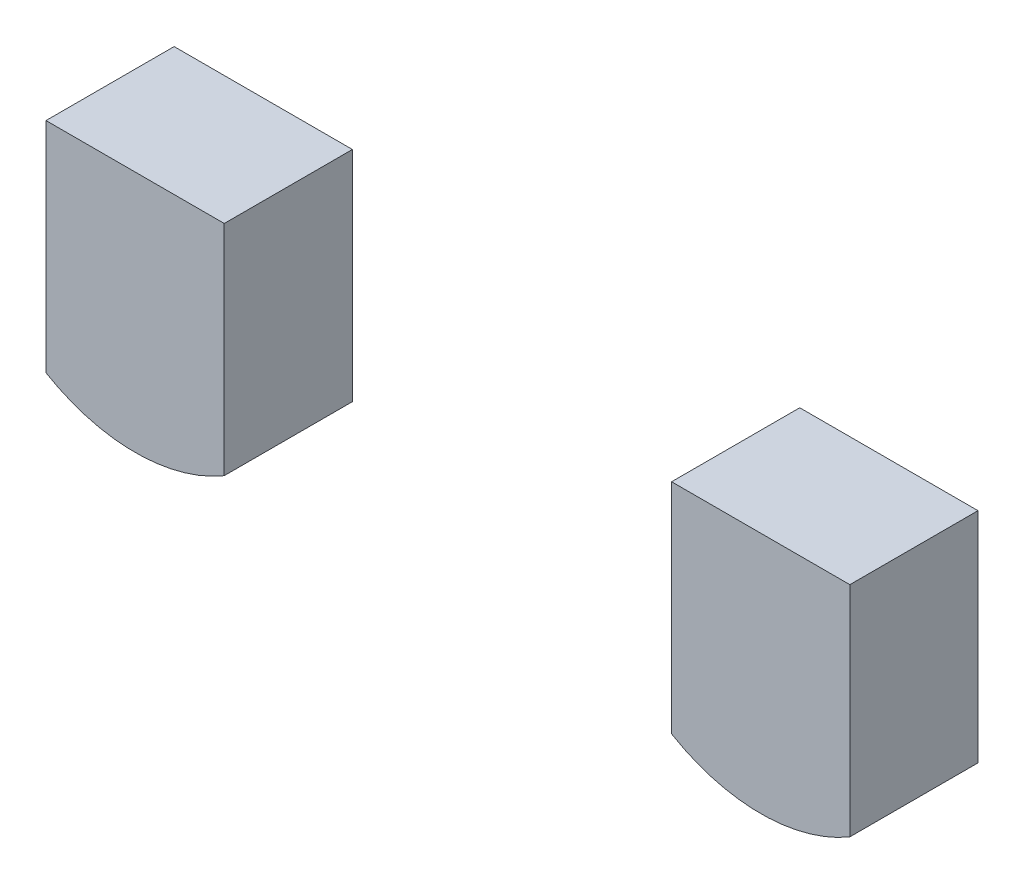
ISO-10303-21;
HEADER;
FILE_DESCRIPTION(('STEP AP214'),'2;1');
FILE_NAME('part.step','',(''),(''),'','','');
FILE_SCHEMA(('AUTOMOTIVE_DESIGN { 1 0 10303 214 1 1 1 1 }'));
ENDSEC;
DATA;
#1=APPLICATION_CONTEXT('core data for automotive mechanical design processes');
#2=APPLICATION_PROTOCOL_DEFINITION('international standard','automotive_design',2000,#1);
#3=PRODUCT_CONTEXT('',#1,'mechanical');
#4=PRODUCT('Part','Part','',(#3));
#5=PRODUCT_RELATED_PRODUCT_CATEGORY('part','',(#4));
#6=PRODUCT_DEFINITION_FORMATION('','',#4);
#7=PRODUCT_DEFINITION_CONTEXT('part definition',#1,'design');
#8=PRODUCT_DEFINITION('design','',#6,#7);
#9=PRODUCT_DEFINITION_SHAPE('','',#8);
#10=(LENGTH_UNIT() NAMED_UNIT(*) SI_UNIT(.MILLI.,.METRE.));
#11=(NAMED_UNIT(*) PLANE_ANGLE_UNIT() SI_UNIT($,.RADIAN.));
#12=(NAMED_UNIT(*) SI_UNIT($,.STERADIAN.) SOLID_ANGLE_UNIT());
#13=UNCERTAINTY_MEASURE_WITH_UNIT(LENGTH_MEASURE(1.E-05),#10,'distance_accuracy_value','');
#14=(GEOMETRIC_REPRESENTATION_CONTEXT(3) GLOBAL_UNCERTAINTY_ASSIGNED_CONTEXT((#13)) GLOBAL_UNIT_ASSIGNED_CONTEXT((#10,
#11,#12)) REPRESENTATION_CONTEXT('',''));
#15=CARTESIAN_POINT('',(0.,0.,0.));
#16=DIRECTION('',(0.,0.,1.));
#17=DIRECTION('',(1.,0.,0.));
#18=AXIS2_PLACEMENT_3D('',#15,#16,#17);
#19=CARTESIAN_POINT('',(3.83000000000006,-10.9171416205416,3.30000000000001));
#20=DIRECTION('',(0.,0.,1.));
#21=DIRECTION('',(1.,0.,0.));
#22=AXIS2_PLACEMENT_3D('',#19,#20,#21);
#23=PLANE('',#22);
#24=DIRECTION('',(0.,-1.,0.));
#25=VECTOR('',#24,1.);
#26=CARTESIAN_POINT('',(6.90000000000007,-8.12500000000001,3.30000000000001));
#27=LINE('',#26,#25);
#28=CARTESIAN_POINT('',(6.90000000000007,-6.25000000000001,3.30000000000001));
#29=VERTEX_POINT('',#28);
#30=CARTESIAN_POINT('',(6.90000000000006,-10.,3.30000000000001));
#31=VERTEX_POINT('',#30);
#32=EDGE_CURVE('P0_E50',#29,#31,#27,.T.);
#33=ORIENTED_EDGE('',*,*,#32,.F.);
#34=DIRECTION('',(1.,0.,0.));
#35=VECTOR('',#34,1.);
#36=CARTESIAN_POINT('',(5.37000000000008,-6.25000000000001,3.30000000000002));
#37=LINE('',#36,#35);
#38=CARTESIAN_POINT('',(3.84000000000008,-6.25,3.30000000000001));
#39=VERTEX_POINT('',#38);
#40=EDGE_CURVE('P0_E58',#39,#29,#37,.T.);
#41=ORIENTED_EDGE('',*,*,#40,.F.);
#42=DIRECTION('',(0.,1.,0.));
#43=VECTOR('',#42,1.);
#44=CARTESIAN_POINT('',(3.84000000000007,-8.125,3.30000000000001));
#45=LINE('',#44,#43);
#46=CARTESIAN_POINT('',(3.84000000000006,-10.,3.30000000000001));
#47=VERTEX_POINT('',#46);
#48=EDGE_CURVE('P0_E69',#47,#39,#45,.T.);
#49=ORIENTED_EDGE('',*,*,#48,.F.);
#50=CARTESIAN_POINT('',(5.37000000000006,-7.41947679723659,3.30000000000001));
#51=DIRECTION('',(0.,0.,-1.));
#52=DIRECTION('',(-1.,0.,0.));
#53=AXIS2_PLACEMENT_3D('',#50,#51,#52);
#54=CIRCLE('',#53,3.00000000000006);
#55=EDGE_CURVE('P0_E21',#31,#47,#54,.T.);
#56=ORIENTED_EDGE('',*,*,#55,.F.);
#57=EDGE_LOOP('',(#33,#41,#49,#56));
#58=FACE_BOUND('',#57,.T.);
#59=ADVANCED_FACE('P0_F17',(#58),#23,.T.);
#60=CARTESIAN_POINT('',(3.84000000000008,-6.24,1.09));
#61=DIRECTION('',(-1.,0.,0.));
#62=DIRECTION('',(0.,-1.,0.));
#63=AXIS2_PLACEMENT_3D('',#60,#61,#62);
#64=PLANE('',#63);
#65=DIRECTION('',(0.,0.,1.));
#66=VECTOR('',#65,1.);
#67=CARTESIAN_POINT('',(3.84000000000008,-6.25,2.2));
#68=LINE('',#67,#66);
#69=CARTESIAN_POINT('',(3.84000000000008,-6.25,1.1));
#70=VERTEX_POINT('',#69);
#71=EDGE_CURVE('P0_E62',#70,#39,#68,.T.);
#72=ORIENTED_EDGE('',*,*,#71,.F.);
#73=DIRECTION('',(0.,1.,0.));
#74=VECTOR('',#73,1.);
#75=CARTESIAN_POINT('',(3.84000000000007,-8.5785708102708,1.1));
#76=LINE('',#75,#74);
#77=CARTESIAN_POINT('',(3.84000000000007,-10.,1.10000000000001));
#78=VERTEX_POINT('',#77);
#79=EDGE_CURVE('P0_E67',#78,#70,#76,.T.);
#80=ORIENTED_EDGE('',*,*,#79,.F.);
#81=DIRECTION('',(0.,0.,-1.));
#82=VECTOR('',#81,1.);
#83=CARTESIAN_POINT('',(3.84000000000006,-10.,2.20000000000001));
#84=LINE('',#83,#82);
#85=EDGE_CURVE('P0_E78',#47,#78,#84,.T.);
#86=ORIENTED_EDGE('',*,*,#85,.F.);
#87=ORIENTED_EDGE('',*,*,#48,.T.);
#88=EDGE_LOOP('',(#72,#80,#86,#87));
#89=FACE_BOUND('',#88,.T.);
#90=ADVANCED_FACE('P0_F64',(#89),#64,.T.);
#91=CARTESIAN_POINT('',(6.91000000000007,-6.25000000000001,1.09000000000001));
#92=DIRECTION('',(0.,1.,0.));
#93=DIRECTION('',(-1.,0.,0.));
#94=AXIS2_PLACEMENT_3D('',#91,#92,#93);
#95=PLANE('',#94);
#96=DIRECTION('',(0.,0.,1.));
#97=VECTOR('',#96,1.);
#98=CARTESIAN_POINT('',(6.90000000000007,-6.25000000000001,2.20000000000001));
#99=LINE('',#98,#97);
#100=CARTESIAN_POINT('',(6.90000000000007,-6.25000000000001,1.10000000000001));
#101=VERTEX_POINT('',#100);
#102=EDGE_CURVE('P0_E74',#101,#29,#99,.T.);
#103=ORIENTED_EDGE('',*,*,#102,.F.);
#104=DIRECTION('',(1.,0.,0.));
#105=VECTOR('',#104,1.);
#106=CARTESIAN_POINT('',(5.37000000000007,-6.25000000000001,1.1));
#107=LINE('',#106,#105);
#108=EDGE_CURVE('P0_E72',#70,#101,#107,.T.);
#109=ORIENTED_EDGE('',*,*,#108,.F.);
#110=ORIENTED_EDGE('',*,*,#71,.T.);
#111=ORIENTED_EDGE('',*,*,#40,.T.);
#112=EDGE_LOOP('',(#103,#109,#110,#111));
#113=FACE_BOUND('',#112,.T.);
#114=ADVANCED_FACE('P0_F73',(#113),#95,.T.);
#115=CARTESIAN_POINT('',(6.90000000000006,-10.01,1.09000000000001));
#116=DIRECTION('',(1.,0.,0.));
#117=DIRECTION('',(0.,1.,0.));
#118=AXIS2_PLACEMENT_3D('',#115,#116,#117);
#119=PLANE('',#118);
#120=DIRECTION('',(0.,0.,1.));
#121=VECTOR('',#120,1.);
#122=CARTESIAN_POINT('',(6.90000000000007,-10.,2.20000000000001));
#123=LINE('',#122,#121);
#124=CARTESIAN_POINT('',(6.90000000000007,-10.,1.10000000000001));
#125=VERTEX_POINT('',#124);
#126=EDGE_CURVE('P0_E35',#125,#31,#123,.T.);
#127=ORIENTED_EDGE('',*,*,#126,.F.);
#128=DIRECTION('',(0.,-1.,0.));
#129=VECTOR('',#128,1.);
#130=CARTESIAN_POINT('',(6.90000000000007,-8.5785708102708,1.10000000000001));
#131=LINE('',#130,#129);
#132=EDGE_CURVE('P0_E27',#101,#125,#131,.T.);
#133=ORIENTED_EDGE('',*,*,#132,.F.);
#134=ORIENTED_EDGE('',*,*,#102,.T.);
#135=ORIENTED_EDGE('',*,*,#32,.T.);
#136=EDGE_LOOP('',(#127,#133,#134,#135));
#137=FACE_BOUND('',#136,.T.);
#138=ADVANCED_FACE('P0_F103',(#137),#119,.T.);
#139=CARTESIAN_POINT('',(5.37000000000006,-7.41947679723659,3.30000000000001));
#140=DIRECTION('',(0.,0.,-1.));
#141=DIRECTION('',(-1.,0.,0.));
#142=AXIS2_PLACEMENT_3D('',#139,#140,#141);
#143=CYLINDRICAL_SURFACE('',#142,3.00000000000006);
#144=ORIENTED_EDGE('',*,*,#85,.T.);
#145=CARTESIAN_POINT('',(5.37000000000006,-7.41947679723659,1.10000000000001));
#146=DIRECTION('',(0.,0.,-1.));
#147=DIRECTION('',(-1.,0.,0.));
#148=AXIS2_PLACEMENT_3D('',#145,#146,#147);
#149=CIRCLE('',#148,3.00000000000006);
#150=EDGE_CURVE('P0_E11',#125,#78,#149,.T.);
#151=ORIENTED_EDGE('',*,*,#150,.F.);
#152=ORIENTED_EDGE('',*,*,#126,.T.);
#153=ORIENTED_EDGE('',*,*,#55,.T.);
#154=EDGE_LOOP('',(#144,#151,#152,#153));
#155=FACE_BOUND('',#154,.T.);
#156=ADVANCED_FACE('P0_F105',(#155),#143,.T.);
#157=CARTESIAN_POINT('',(6.91000000000006,-10.9171416205416,1.10000000000001));
#158=DIRECTION('',(0.,0.,-1.));
#159=DIRECTION('',(-1.,0.,0.));
#160=AXIS2_PLACEMENT_3D('',#157,#158,#159);
#161=PLANE('',#160);
#162=ORIENTED_EDGE('',*,*,#132,.T.);
#163=ORIENTED_EDGE('',*,*,#150,.T.);
#164=ORIENTED_EDGE('',*,*,#79,.T.);
#165=ORIENTED_EDGE('',*,*,#108,.T.);
#166=EDGE_LOOP('',(#162,#163,#164,#165));
#167=FACE_BOUND('',#166,.T.);
#168=ADVANCED_FACE('P0_F19',(#167),#161,.T.);
#169=CLOSED_SHELL('',(#59,#90,#114,#138,#156,#168));
#170=MANIFOLD_SOLID_BREP('P0_B1',#169);
#171=CARTESIAN_POINT('',(-6.90999999999993,-10.9171416205416,3.3));
#172=DIRECTION('',(0.,0.,1.));
#173=DIRECTION('',(1.,0.,0.));
#174=AXIS2_PLACEMENT_3D('',#171,#172,#173);
#175=PLANE('',#174);
#176=DIRECTION('',(0.,-1.,0.));
#177=VECTOR('',#176,1.);
#178=CARTESIAN_POINT('',(-3.83999999999992,-8.125,3.3));
#179=LINE('',#178,#177);
#180=CARTESIAN_POINT('',(-3.83999999999992,-6.25,3.3));
#181=VERTEX_POINT('',#180);
#182=CARTESIAN_POINT('',(-3.83999999999993,-10.,3.3));
#183=VERTEX_POINT('',#182);
#184=EDGE_CURVE('P1_E50',#181,#183,#179,.T.);
#185=ORIENTED_EDGE('',*,*,#184,.F.);
#186=DIRECTION('',(1.,0.,0.));
#187=VECTOR('',#186,1.);
#188=CARTESIAN_POINT('',(-5.36999999999992,-6.25,3.3));
#189=LINE('',#188,#187);
#190=CARTESIAN_POINT('',(-6.89999999999991,-6.24999999999999,3.3));
#191=VERTEX_POINT('',#190);
#192=EDGE_CURVE('P1_E58',#191,#181,#189,.T.);
#193=ORIENTED_EDGE('',*,*,#192,.F.);
#194=DIRECTION('',(0.,1.,0.));
#195=VECTOR('',#194,1.);
#196=CARTESIAN_POINT('',(-6.89999999999992,-8.12499999999999,3.3));
#197=LINE('',#196,#195);
#198=CARTESIAN_POINT('',(-6.89999999999993,-10.,3.3));
#199=VERTEX_POINT('',#198);
#200=EDGE_CURVE('P1_E69',#199,#191,#197,.T.);
#201=ORIENTED_EDGE('',*,*,#200,.F.);
#202=CARTESIAN_POINT('',(-5.36999999999993,-7.41947679723659,3.3));
#203=DIRECTION('',(0.,0.,-1.));
#204=DIRECTION('',(-1.,0.,0.));
#205=AXIS2_PLACEMENT_3D('',#202,#203,#204);
#206=CIRCLE('',#205,3.00000000000006);
#207=EDGE_CURVE('P1_E21',#183,#199,#206,.T.);
#208=ORIENTED_EDGE('',*,*,#207,.F.);
#209=EDGE_LOOP('',(#185,#193,#201,#208));
#210=FACE_BOUND('',#209,.T.);
#211=ADVANCED_FACE('P1_F17',(#210),#175,.T.);
#212=CARTESIAN_POINT('',(-6.89999999999991,-6.23999999999999,1.09));
#213=DIRECTION('',(-1.,0.,0.));
#214=DIRECTION('',(0.,-1.,0.));
#215=AXIS2_PLACEMENT_3D('',#212,#213,#214);
#216=PLANE('',#215);
#217=DIRECTION('',(0.,0.,1.));
#218=VECTOR('',#217,1.);
#219=CARTESIAN_POINT('',(-6.89999999999991,-6.24999999999999,2.2));
#220=LINE('',#219,#218);
#221=CARTESIAN_POINT('',(-6.89999999999992,-6.24999999999999,1.1));
#222=VERTEX_POINT('',#221);
#223=EDGE_CURVE('P1_E62',#222,#191,#220,.T.);
#224=ORIENTED_EDGE('',*,*,#223,.F.);
#225=DIRECTION('',(0.,1.,0.));
#226=VECTOR('',#225,1.);
#227=CARTESIAN_POINT('',(-6.89999999999993,-8.5785708102708,1.1));
#228=LINE('',#227,#226);
#229=CARTESIAN_POINT('',(-6.89999999999993,-10.,1.1));
#230=VERTEX_POINT('',#229);
#231=EDGE_CURVE('P1_E67',#230,#222,#228,.T.);
#232=ORIENTED_EDGE('',*,*,#231,.F.);
#233=DIRECTION('',(0.,0.,-1.));
#234=VECTOR('',#233,1.);
#235=CARTESIAN_POINT('',(-6.89999999999993,-10.,2.2));
#236=LINE('',#235,#234);
#237=EDGE_CURVE('P1_E78',#199,#230,#236,.T.);
#238=ORIENTED_EDGE('',*,*,#237,.F.);
#239=ORIENTED_EDGE('',*,*,#200,.T.);
#240=EDGE_LOOP('',(#224,#232,#238,#239));
#241=FACE_BOUND('',#240,.T.);
#242=ADVANCED_FACE('P1_F64',(#241),#216,.T.);
#243=CARTESIAN_POINT('',(-3.82999999999992,-6.25,1.09));
#244=DIRECTION('',(0.,1.,0.));
#245=DIRECTION('',(-1.,0.,0.));
#246=AXIS2_PLACEMENT_3D('',#243,#244,#245);
#247=PLANE('',#246);
#248=DIRECTION('',(0.,0.,1.));
#249=VECTOR('',#248,1.);
#250=CARTESIAN_POINT('',(-3.83999999999992,-6.25,2.2));
#251=LINE('',#250,#249);
#252=CARTESIAN_POINT('',(-3.83999999999992,-6.25,1.1));
#253=VERTEX_POINT('',#252);
#254=EDGE_CURVE('P1_E74',#253,#181,#251,.T.);
#255=ORIENTED_EDGE('',*,*,#254,.F.);
#256=DIRECTION('',(1.,0.,0.));
#257=VECTOR('',#256,1.);
#258=CARTESIAN_POINT('',(-5.36999999999992,-6.25,1.1));
#259=LINE('',#258,#257);
#260=EDGE_CURVE('P1_E72',#222,#253,#259,.T.);
#261=ORIENTED_EDGE('',*,*,#260,.F.);
#262=ORIENTED_EDGE('',*,*,#223,.T.);
#263=ORIENTED_EDGE('',*,*,#192,.T.);
#264=EDGE_LOOP('',(#255,#261,#262,#263));
#265=FACE_BOUND('',#264,.T.);
#266=ADVANCED_FACE('P1_F73',(#265),#247,.T.);
#267=CARTESIAN_POINT('',(-3.83999999999993,-10.01,1.09));
#268=DIRECTION('',(1.,0.,0.));
#269=DIRECTION('',(0.,1.,0.));
#270=AXIS2_PLACEMENT_3D('',#267,#268,#269);
#271=PLANE('',#270);
#272=DIRECTION('',(0.,0.,1.));
#273=VECTOR('',#272,1.);
#274=CARTESIAN_POINT('',(-3.83999999999993,-10.,2.2));
#275=LINE('',#274,#273);
#276=CARTESIAN_POINT('',(-3.83999999999993,-10.,1.1));
#277=VERTEX_POINT('',#276);
#278=EDGE_CURVE('P1_E35',#277,#183,#275,.T.);
#279=ORIENTED_EDGE('',*,*,#278,.F.);
#280=DIRECTION('',(0.,-1.,0.));
#281=VECTOR('',#280,1.);
#282=CARTESIAN_POINT('',(-3.83999999999992,-8.5785708102708,1.1));
#283=LINE('',#282,#281);
#284=EDGE_CURVE('P1_E27',#253,#277,#283,.T.);
#285=ORIENTED_EDGE('',*,*,#284,.F.);
#286=ORIENTED_EDGE('',*,*,#254,.T.);
#287=ORIENTED_EDGE('',*,*,#184,.T.);
#288=EDGE_LOOP('',(#279,#285,#286,#287));
#289=FACE_BOUND('',#288,.T.);
#290=ADVANCED_FACE('P1_F103',(#289),#271,.T.);
#291=CARTESIAN_POINT('',(-5.36999999999993,-7.41947679723659,3.3));
#292=DIRECTION('',(0.,0.,-1.));
#293=DIRECTION('',(-1.,0.,0.));
#294=AXIS2_PLACEMENT_3D('',#291,#292,#293);
#295=CYLINDRICAL_SURFACE('',#294,3.00000000000006);
#296=ORIENTED_EDGE('',*,*,#237,.T.);
#297=CARTESIAN_POINT('',(-5.36999999999993,-7.41947679723659,1.1));
#298=DIRECTION('',(0.,0.,-1.));
#299=DIRECTION('',(-1.,0.,0.));
#300=AXIS2_PLACEMENT_3D('',#297,#298,#299);
#301=CIRCLE('',#300,3.00000000000006);
#302=EDGE_CURVE('P1_E11',#277,#230,#301,.T.);
#303=ORIENTED_EDGE('',*,*,#302,.F.);
#304=ORIENTED_EDGE('',*,*,#278,.T.);
#305=ORIENTED_EDGE('',*,*,#207,.T.);
#306=EDGE_LOOP('',(#296,#303,#304,#305));
#307=FACE_BOUND('',#306,.T.);
#308=ADVANCED_FACE('P1_F105',(#307),#295,.T.);
#309=CARTESIAN_POINT('',(-3.82999999999993,-10.9171416205416,1.1));
#310=DIRECTION('',(0.,0.,-1.));
#311=DIRECTION('',(-1.,0.,0.));
#312=AXIS2_PLACEMENT_3D('',#309,#310,#311);
#313=PLANE('',#312);
#314=ORIENTED_EDGE('',*,*,#284,.T.);
#315=ORIENTED_EDGE('',*,*,#302,.T.);
#316=ORIENTED_EDGE('',*,*,#231,.T.);
#317=ORIENTED_EDGE('',*,*,#260,.T.);
#318=EDGE_LOOP('',(#314,#315,#316,#317));
#319=FACE_BOUND('',#318,.T.);
#320=ADVANCED_FACE('P1_F19',(#319),#313,.T.);
#321=CLOSED_SHELL('',(#211,#242,#266,#290,#308,#320));
#322=MANIFOLD_SOLID_BREP('P1_B1',#321);
#323=ADVANCED_BREP_SHAPE_REPRESENTATION('',(#18,#170,#322),#14);
#324=SHAPE_DEFINITION_REPRESENTATION(#9,#323);
ENDSEC;
END-ISO-10303-21;
